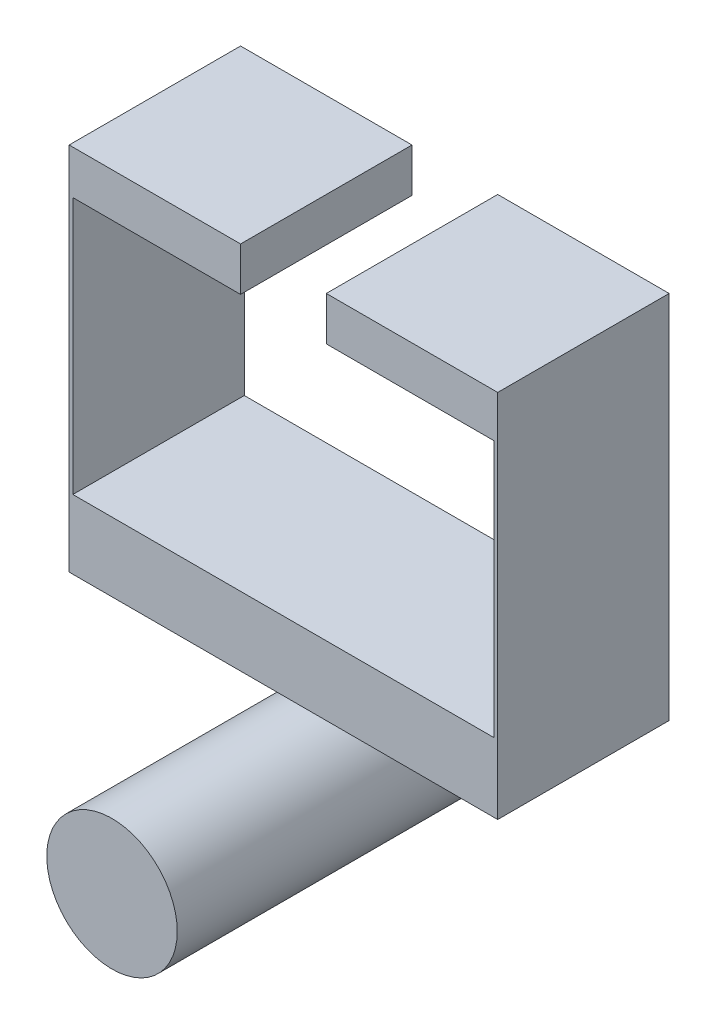
ISO-10303-21;
HEADER;
FILE_DESCRIPTION(('STEP AP214'),'2;1');
FILE_NAME('part.step','',(''),(''),'','','');
FILE_SCHEMA(('AUTOMOTIVE_DESIGN { 1 0 10303 214 1 1 1 1 }'));
ENDSEC;
DATA;
#1=APPLICATION_CONTEXT('core data for automotive mechanical design processes');
#2=APPLICATION_PROTOCOL_DEFINITION('international standard','automotive_design',2000,#1);
#3=PRODUCT_CONTEXT('',#1,'mechanical');
#4=PRODUCT('Part','Part','',(#3));
#5=PRODUCT_RELATED_PRODUCT_CATEGORY('part','',(#4));
#6=PRODUCT_DEFINITION_FORMATION('','',#4);
#7=PRODUCT_DEFINITION_CONTEXT('part definition',#1,'design');
#8=PRODUCT_DEFINITION('design','',#6,#7);
#9=PRODUCT_DEFINITION_SHAPE('','',#8);
#10=(LENGTH_UNIT() NAMED_UNIT(*) SI_UNIT(.MILLI.,.METRE.));
#11=(NAMED_UNIT(*) PLANE_ANGLE_UNIT() SI_UNIT($,.RADIAN.));
#12=(NAMED_UNIT(*) SI_UNIT($,.STERADIAN.) SOLID_ANGLE_UNIT());
#13=UNCERTAINTY_MEASURE_WITH_UNIT(LENGTH_MEASURE(1.E-05),#10,'distance_accuracy_value','');
#14=(GEOMETRIC_REPRESENTATION_CONTEXT(3) GLOBAL_UNCERTAINTY_ASSIGNED_CONTEXT((#13)) GLOBAL_UNIT_ASSIGNED_CONTEXT((#10,
#11,#12)) REPRESENTATION_CONTEXT('',''));
#15=CARTESIAN_POINT('',(0.,0.,0.));
#16=DIRECTION('',(0.,0.,1.));
#17=DIRECTION('',(1.,0.,0.));
#18=AXIS2_PLACEMENT_3D('',#15,#16,#17);
#19=CARTESIAN_POINT('',(0.,0.,50.8));
#20=DIRECTION('',(0.,0.,-1.));
#21=DIRECTION('',(-1.,0.,0.));
#22=AXIS2_PLACEMENT_3D('',#19,#20,#21);
#23=CYLINDRICAL_SURFACE('',#22,9.66721513747675);
#24=CARTESIAN_POINT('',(0.,0.,50.8));
#25=DIRECTION('',(0.,0.,1.));
#26=DIRECTION('',(1.,0.,0.));
#27=AXIS2_PLACEMENT_3D('',#24,#25,#26);
#28=CIRCLE('',#27,9.66721513747675);
#29=CARTESIAN_POINT('',(9.66721513747675,0.,50.8));
#30=VERTEX_POINT('',#29);
#31=EDGE_CURVE('E55',#30,#30,#28,.T.);
#32=ORIENTED_EDGE('',*,*,#31,.F.);
#33=EDGE_LOOP('',(#32));
#34=FACE_BOUND('',#33,.T.);
#35=DIRECTION('',(0.,0.,-1.));
#36=VECTOR('',#35,1.);
#37=CARTESIAN_POINT('',(9.66721513747675,0.,8.89));
#38=LINE('',#37,#36);
#39=CARTESIAN_POINT('',(9.66721513747675,0.,8.89));
#40=VERTEX_POINT('',#39);
#41=CARTESIAN_POINT('',(9.66721513747675,0.,0.));
#42=VERTEX_POINT('',#41);
#43=EDGE_CURVE('E313',#40,#42,#38,.T.);
#44=ORIENTED_EDGE('',*,*,#43,.F.);
#45=CARTESIAN_POINT('',(0.,0.,8.89));
#46=DIRECTION('',(0.,0.,-1.));
#47=DIRECTION('',(-1.,0.,0.));
#48=AXIS2_PLACEMENT_3D('',#45,#46,#47);
#49=CIRCLE('',#48,9.66721513747675);
#50=CARTESIAN_POINT('',(-9.66721513747675,0.,8.89));
#51=VERTEX_POINT('',#50);
#52=EDGE_CURVE('E11',#51,#40,#49,.T.);
#53=ORIENTED_EDGE('',*,*,#52,.F.);
#54=DIRECTION('',(0.,0.,-1.));
#55=VECTOR('',#54,1.);
#56=CARTESIAN_POINT('',(-9.66721513747675,0.,8.89));
#57=LINE('',#56,#55);
#58=CARTESIAN_POINT('',(-9.66721513747675,0.,0.));
#59=VERTEX_POINT('',#58);
#60=EDGE_CURVE('E306',#51,#59,#57,.T.);
#61=ORIENTED_EDGE('',*,*,#60,.T.);
#62=CARTESIAN_POINT('',(0.,0.,0.));
#63=DIRECTION('',(0.,0.,1.));
#64=DIRECTION('',(1.,0.,0.));
#65=AXIS2_PLACEMENT_3D('',#62,#63,#64);
#66=CIRCLE('',#65,9.66721513747675);
#67=EDGE_CURVE('E317',#59,#42,#66,.T.);
#68=ORIENTED_EDGE('',*,*,#67,.T.);
#69=EDGE_LOOP('',(#44,#53,#61,#68));
#70=FACE_BOUND('',#69,.T.);
#71=ADVANCED_FACE('F47',(#34,#70),#23,.T.);
#72=CARTESIAN_POINT('',(0.,0.,50.8));
#73=DIRECTION('',(0.,0.,1.));
#74=DIRECTION('',(1.,0.,0.));
#75=AXIS2_PLACEMENT_3D('',#72,#73,#74);
#76=PLANE('',#75);
#77=ORIENTED_EDGE('',*,*,#31,.T.);
#78=EDGE_LOOP('',(#77));
#79=FACE_BOUND('',#78,.T.);
#80=ADVANCED_FACE('F398',(#79),#76,.T.);
#81=CARTESIAN_POINT('',(0.,0.,0.));
#82=DIRECTION('',(0.,0.,1.));
#83=DIRECTION('',(1.,0.,0.));
#84=AXIS2_PLACEMENT_3D('',#81,#82,#83);
#85=PLANE('',#84);
#86=ORIENTED_EDGE('',*,*,#67,.F.);
#87=DIRECTION('',(0.,1.,0.));
#88=VECTOR('',#87,1.);
#89=CARTESIAN_POINT('',(-9.66721513747675,0.,0.));
#90=LINE('',#89,#88);
#91=CARTESIAN_POINT('',(-9.66721513747675,12.7,0.));
#92=VERTEX_POINT('',#91);
#93=EDGE_CURVE('E290',#59,#92,#90,.T.);
#94=ORIENTED_EDGE('',*,*,#93,.T.);
#95=DIRECTION('',(-1.,0.,0.));
#96=VECTOR('',#95,1.);
#97=CARTESIAN_POINT('',(-9.66721513747675,12.7,0.));
#98=LINE('',#97,#96);
#99=CARTESIAN_POINT('',(-31.75,12.7,0.));
#100=VERTEX_POINT('',#99);
#101=EDGE_CURVE('E170',#92,#100,#98,.T.);
#102=ORIENTED_EDGE('',*,*,#101,.T.);
#103=DIRECTION('',(0.,1.,0.));
#104=VECTOR('',#103,1.);
#105=CARTESIAN_POINT('',(-31.75,22.935187233977,0.));
#106=LINE('',#105,#104);
#107=CARTESIAN_POINT('',(-31.75,67.5084880215063,0.));
#108=VERTEX_POINT('',#107);
#109=EDGE_CURVE('E264',#100,#108,#106,.T.);
#110=ORIENTED_EDGE('',*,*,#109,.T.);
#111=DIRECTION('',(1.,0.,0.));
#112=VECTOR('',#111,1.);
#113=CARTESIAN_POINT('',(-31.75,67.5084880215063,0.));
#114=LINE('',#113,#112);
#115=CARTESIAN_POINT('',(-6.35,67.5084880215063,0.));
#116=VERTEX_POINT('',#115);
#117=EDGE_CURVE('E199',#108,#116,#114,.T.);
#118=ORIENTED_EDGE('',*,*,#117,.T.);
#119=DIRECTION('',(0.,-1.,0.));
#120=VECTOR('',#119,1.);
#121=CARTESIAN_POINT('',(-6.35,61.035187233977,0.));
#122=LINE('',#121,#120);
#123=CARTESIAN_POINT('',(-6.35,61.035187233977,0.));
#124=VERTEX_POINT('',#123);
#125=EDGE_CURVE('E222',#116,#124,#122,.T.);
#126=ORIENTED_EDGE('',*,*,#125,.T.);
#127=DIRECTION('',(-1.,0.,0.));
#128=VECTOR('',#127,1.);
#129=CARTESIAN_POINT('',(-31.75,61.035187233977,0.));
#130=LINE('',#129,#128);
#131=CARTESIAN_POINT('',(-31.2000836865377,61.035187233977,0.));
#132=VERTEX_POINT('',#131);
#133=EDGE_CURVE('E211',#124,#132,#130,.T.);
#134=ORIENTED_EDGE('',*,*,#133,.T.);
#135=DIRECTION('',(0.,-1.,0.));
#136=VECTOR('',#135,1.);
#137=CARTESIAN_POINT('',(-31.2000836865377,22.935187233977,0.));
#138=LINE('',#137,#136);
#139=CARTESIAN_POINT('',(-31.2000836865377,22.935187233977,0.));
#140=VERTEX_POINT('',#139);
#141=EDGE_CURVE('E248',#132,#140,#138,.T.);
#142=ORIENTED_EDGE('',*,*,#141,.T.);
#143=DIRECTION('',(1.,0.,0.));
#144=VECTOR('',#143,1.);
#145=CARTESIAN_POINT('',(31.75,22.935187233977,0.));
#146=LINE('',#145,#144);
#147=CARTESIAN_POINT('',(31.2000836865377,22.935187233977,0.));
#148=VERTEX_POINT('',#147);
#149=EDGE_CURVE('E171',#140,#148,#146,.T.);
#150=ORIENTED_EDGE('',*,*,#149,.T.);
#151=DIRECTION('',(0.,1.,0.));
#152=VECTOR('',#151,1.);
#153=CARTESIAN_POINT('',(31.2000836865377,22.935187233977,0.));
#154=LINE('',#153,#152);
#155=CARTESIAN_POINT('',(31.2000836865377,61.035187233977,0.));
#156=VERTEX_POINT('',#155);
#157=EDGE_CURVE('E244',#148,#156,#154,.T.);
#158=ORIENTED_EDGE('',*,*,#157,.T.);
#159=DIRECTION('',(-1.,0.,0.));
#160=VECTOR('',#159,1.);
#161=CARTESIAN_POINT('',(31.75,61.035187233977,0.));
#162=LINE('',#161,#160);
#163=CARTESIAN_POINT('',(6.35,61.035187233977,0.));
#164=VERTEX_POINT('',#163);
#165=EDGE_CURVE('E191',#156,#164,#162,.T.);
#166=ORIENTED_EDGE('',*,*,#165,.T.);
#167=DIRECTION('',(0.,1.,0.));
#168=VECTOR('',#167,1.);
#169=CARTESIAN_POINT('',(6.35,61.035187233977,0.));
#170=LINE('',#169,#168);
#171=CARTESIAN_POINT('',(6.35,67.5084880215063,0.));
#172=VERTEX_POINT('',#171);
#173=EDGE_CURVE('E185',#164,#172,#170,.T.);
#174=ORIENTED_EDGE('',*,*,#173,.T.);
#175=DIRECTION('',(1.,0.,0.));
#176=VECTOR('',#175,1.);
#177=CARTESIAN_POINT('',(31.75,67.5084880215063,0.));
#178=LINE('',#177,#176);
#179=CARTESIAN_POINT('',(31.75,67.5084880215063,0.));
#180=VERTEX_POINT('',#179);
#181=EDGE_CURVE('E176',#172,#180,#178,.T.);
#182=ORIENTED_EDGE('',*,*,#181,.T.);
#183=DIRECTION('',(0.,-1.,0.));
#184=VECTOR('',#183,1.);
#185=CARTESIAN_POINT('',(31.75,12.7,0.));
#186=LINE('',#185,#184);
#187=CARTESIAN_POINT('',(31.75,12.7,0.));
#188=VERTEX_POINT('',#187);
#189=EDGE_CURVE('E159',#180,#188,#186,.T.);
#190=ORIENTED_EDGE('',*,*,#189,.T.);
#191=CARTESIAN_POINT('',(9.66721513747675,12.7,0.));
#192=VERTEX_POINT('',#191);
#193=EDGE_CURVE('E271',#188,#192,#98,.T.);
#194=ORIENTED_EDGE('',*,*,#193,.T.);
#195=DIRECTION('',(0.,-1.,0.));
#196=VECTOR('',#195,1.);
#197=CARTESIAN_POINT('',(9.66721513747675,12.7,0.));
#198=LINE('',#197,#196);
#199=EDGE_CURVE('E298',#192,#42,#198,.T.);
#200=ORIENTED_EDGE('',*,*,#199,.T.);
#201=EDGE_LOOP('',(#86,#94,#102,#110,#118,#126,#134,#142,#150,#158,#166,#174,#182,#190,#194,#200));
#202=FACE_BOUND('',#201,.T.);
#203=ADVANCED_FACE('F183',(#202),#85,.F.);
#204=CARTESIAN_POINT('',(9.66721513747675,12.7,8.89));
#205=DIRECTION('',(1.,0.,0.));
#206=DIRECTION('',(0.,1.,0.));
#207=AXIS2_PLACEMENT_3D('',#204,#205,#206);
#208=PLANE('',#207);
#209=ORIENTED_EDGE('',*,*,#199,.F.);
#210=DIRECTION('',(0.,0.,-1.));
#211=VECTOR('',#210,1.);
#212=CARTESIAN_POINT('',(9.66721513747675,12.7,8.89));
#213=LINE('',#212,#211);
#214=CARTESIAN_POINT('',(9.66721513747675,12.7,8.89));
#215=VERTEX_POINT('',#214);
#216=EDGE_CURVE('E318',#215,#192,#213,.T.);
#217=ORIENTED_EDGE('',*,*,#216,.F.);
#218=DIRECTION('',(0.,-1.,0.));
#219=VECTOR('',#218,1.);
#220=CARTESIAN_POINT('',(9.66721513747675,12.7,8.89));
#221=LINE('',#220,#219);
#222=EDGE_CURVE('E302',#215,#40,#221,.T.);
#223=ORIENTED_EDGE('',*,*,#222,.T.);
#224=ORIENTED_EDGE('',*,*,#43,.T.);
#225=EDGE_LOOP('',(#209,#217,#223,#224));
#226=FACE_BOUND('',#225,.T.);
#227=ADVANCED_FACE('F335',(#226),#208,.T.);
#228=CARTESIAN_POINT('',(-9.66721513747675,0.,8.89));
#229=DIRECTION('',(-1.,0.,0.));
#230=DIRECTION('',(0.,0.,1.));
#231=AXIS2_PLACEMENT_3D('',#228,#229,#230);
#232=PLANE('',#231);
#233=ORIENTED_EDGE('',*,*,#93,.F.);
#234=ORIENTED_EDGE('',*,*,#60,.F.);
#235=DIRECTION('',(0.,1.,0.));
#236=VECTOR('',#235,1.);
#237=CARTESIAN_POINT('',(-9.66721513747675,0.,8.89));
#238=LINE('',#237,#236);
#239=CARTESIAN_POINT('',(-9.66721513747675,12.7,8.89));
#240=VERTEX_POINT('',#239);
#241=EDGE_CURVE('E293',#51,#240,#238,.T.);
#242=ORIENTED_EDGE('',*,*,#241,.T.);
#243=DIRECTION('',(0.,0.,-1.));
#244=VECTOR('',#243,1.);
#245=CARTESIAN_POINT('',(-9.66721513747675,12.7,8.89));
#246=LINE('',#245,#244);
#247=EDGE_CURVE('E322',#240,#92,#246,.T.);
#248=ORIENTED_EDGE('',*,*,#247,.T.);
#249=EDGE_LOOP('',(#233,#234,#242,#248));
#250=FACE_BOUND('',#249,.T.);
#251=ADVANCED_FACE('F345',(#250),#232,.T.);
#252=CARTESIAN_POINT('',(0.,0.,8.89));
#253=DIRECTION('',(0.,0.,-1.));
#254=DIRECTION('',(-1.,0.,0.));
#255=AXIS2_PLACEMENT_3D('',#252,#253,#254);
#256=PLANE('',#255);
#257=ORIENTED_EDGE('',*,*,#241,.F.);
#258=ORIENTED_EDGE('',*,*,#52,.T.);
#259=ORIENTED_EDGE('',*,*,#222,.F.);
#260=DIRECTION('',(1.,0.,0.));
#261=VECTOR('',#260,1.);
#262=CARTESIAN_POINT('',(-9.66721513747675,12.7,8.89));
#263=LINE('',#262,#261);
#264=EDGE_CURVE('E297',#240,#215,#263,.T.);
#265=ORIENTED_EDGE('',*,*,#264,.F.);
#266=EDGE_LOOP('',(#257,#258,#259,#265));
#267=FACE_BOUND('',#266,.T.);
#268=ADVANCED_FACE('F343',(#267),#256,.F.);
#269=CARTESIAN_POINT('',(-9.66721513747675,12.7,25.4));
#270=DIRECTION('',(0.,-1.,0.));
#271=DIRECTION('',(1.,0.,0.));
#272=AXIS2_PLACEMENT_3D('',#269,#270,#271);
#273=PLANE('',#272);
#274=ORIENTED_EDGE('',*,*,#247,.F.);
#275=ORIENTED_EDGE('',*,*,#264,.T.);
#276=ORIENTED_EDGE('',*,*,#216,.T.);
#277=ORIENTED_EDGE('',*,*,#193,.F.);
#278=DIRECTION('',(0.,0.,-1.));
#279=VECTOR('',#278,1.);
#280=CARTESIAN_POINT('',(31.75,12.7,25.4));
#281=LINE('',#280,#279);
#282=CARTESIAN_POINT('',(31.75,12.7,25.4));
#283=VERTEX_POINT('',#282);
#284=EDGE_CURVE('E165',#283,#188,#281,.T.);
#285=ORIENTED_EDGE('',*,*,#284,.F.);
#286=DIRECTION('',(-1.,0.,0.));
#287=VECTOR('',#286,1.);
#288=CARTESIAN_POINT('',(31.75,12.7,25.4));
#289=LINE('',#288,#287);
#290=CARTESIAN_POINT('',(-31.75,12.7,25.4));
#291=VERTEX_POINT('',#290);
#292=EDGE_CURVE('E277',#283,#291,#289,.T.);
#293=ORIENTED_EDGE('',*,*,#292,.T.);
#294=DIRECTION('',(0.,0.,-1.));
#295=VECTOR('',#294,1.);
#296=CARTESIAN_POINT('',(-31.75,12.7,25.4));
#297=LINE('',#296,#295);
#298=EDGE_CURVE('E286',#291,#100,#297,.T.);
#299=ORIENTED_EDGE('',*,*,#298,.T.);
#300=ORIENTED_EDGE('',*,*,#101,.F.);
#301=EDGE_LOOP('',(#274,#275,#276,#277,#285,#293,#299,#300));
#302=FACE_BOUND('',#301,.T.);
#303=ADVANCED_FACE('F339',(#302),#273,.T.);
#304=CARTESIAN_POINT('',(-31.75,22.935187233977,25.4));
#305=DIRECTION('',(-1.,0.,0.));
#306=DIRECTION('',(0.,0.,1.));
#307=AXIS2_PLACEMENT_3D('',#304,#305,#306);
#308=PLANE('',#307);
#309=ORIENTED_EDGE('',*,*,#109,.F.);
#310=ORIENTED_EDGE('',*,*,#298,.F.);
#311=DIRECTION('',(0.,1.,0.));
#312=VECTOR('',#311,1.);
#313=CARTESIAN_POINT('',(-31.75,22.935187233977,25.4));
#314=LINE('',#313,#312);
#315=CARTESIAN_POINT('',(-31.75,67.5084880215063,25.4));
#316=VERTEX_POINT('',#315);
#317=EDGE_CURVE('E268',#291,#316,#314,.T.);
#318=ORIENTED_EDGE('',*,*,#317,.T.);
#319=DIRECTION('',(0.,0.,-1.));
#320=VECTOR('',#319,1.);
#321=CARTESIAN_POINT('',(-31.75,67.5084880215063,25.4));
#322=LINE('',#321,#320);
#323=EDGE_CURVE('E218',#316,#108,#322,.T.);
#324=ORIENTED_EDGE('',*,*,#323,.T.);
#325=EDGE_LOOP('',(#309,#310,#318,#324));
#326=FACE_BOUND('',#325,.T.);
#327=ADVANCED_FACE('F352',(#326),#308,.T.);
#328=CARTESIAN_POINT('',(31.75,12.7,25.4));
#329=DIRECTION('',(1.,0.,0.));
#330=DIRECTION('',(0.,0.,-1.));
#331=AXIS2_PLACEMENT_3D('',#328,#329,#330);
#332=PLANE('',#331);
#333=ORIENTED_EDGE('',*,*,#189,.F.);
#334=DIRECTION('',(0.,0.,-1.));
#335=VECTOR('',#334,1.);
#336=CARTESIAN_POINT('',(31.75,67.5084880215063,25.4));
#337=LINE('',#336,#335);
#338=CARTESIAN_POINT('',(31.75,67.5084880215063,25.4));
#339=VERTEX_POINT('',#338);
#340=EDGE_CURVE('E163',#339,#180,#337,.T.);
#341=ORIENTED_EDGE('',*,*,#340,.F.);
#342=DIRECTION('',(0.,-1.,0.));
#343=VECTOR('',#342,1.);
#344=CARTESIAN_POINT('',(31.75,12.7,25.4));
#345=LINE('',#344,#343);
#346=EDGE_CURVE('E274',#339,#283,#345,.T.);
#347=ORIENTED_EDGE('',*,*,#346,.T.);
#348=ORIENTED_EDGE('',*,*,#284,.T.);
#349=EDGE_LOOP('',(#333,#341,#347,#348));
#350=FACE_BOUND('',#349,.T.);
#351=ADVANCED_FACE('F161',(#350),#332,.T.);
#352=CARTESIAN_POINT('',(31.75,22.935187233977,25.4));
#353=DIRECTION('',(0.,1.,0.));
#354=DIRECTION('',(0.,0.,1.));
#355=AXIS2_PLACEMENT_3D('',#352,#353,#354);
#356=PLANE('',#355);
#357=DIRECTION('',(0.,0.,-1.));
#358=VECTOR('',#357,1.);
#359=CARTESIAN_POINT('',(31.2000836865377,22.935187233977,25.4));
#360=LINE('',#359,#358);
#361=CARTESIAN_POINT('',(31.2000836865377,22.935187233977,25.4));
#362=VERTEX_POINT('',#361);
#363=EDGE_CURVE('E62',#362,#148,#360,.T.);
#364=ORIENTED_EDGE('',*,*,#363,.T.);
#365=ORIENTED_EDGE('',*,*,#149,.F.);
#366=DIRECTION('',(0.,0.,-1.));
#367=VECTOR('',#366,1.);
#368=CARTESIAN_POINT('',(-31.2000836865377,22.935187233977,25.4));
#369=LINE('',#368,#367);
#370=CARTESIAN_POINT('',(-31.2000836865377,22.935187233977,25.4));
#371=VERTEX_POINT('',#370);
#372=EDGE_CURVE('E260',#371,#140,#369,.T.);
#373=ORIENTED_EDGE('',*,*,#372,.F.);
#374=DIRECTION('',(1.,0.,0.));
#375=VECTOR('',#374,1.);
#376=CARTESIAN_POINT('',(31.75,22.935187233977,25.4));
#377=LINE('',#376,#375);
#378=EDGE_CURVE('E67',#371,#362,#377,.T.);
#379=ORIENTED_EDGE('',*,*,#378,.T.);
#380=EDGE_LOOP('',(#364,#365,#373,#379));
#381=FACE_BOUND('',#380,.T.);
#382=ADVANCED_FACE('F372',(#381),#356,.T.);
#383=CARTESIAN_POINT('',(0.,0.,25.4));
#384=DIRECTION('',(0.,0.,-1.));
#385=DIRECTION('',(-1.,0.,0.));
#386=AXIS2_PLACEMENT_3D('',#383,#384,#385);
#387=PLANE('',#386);
#388=ORIENTED_EDGE('',*,*,#317,.F.);
#389=ORIENTED_EDGE('',*,*,#292,.F.);
#390=ORIENTED_EDGE('',*,*,#346,.F.);
#391=DIRECTION('',(1.,0.,0.));
#392=VECTOR('',#391,1.);
#393=CARTESIAN_POINT('',(31.75,67.5084880215063,25.4));
#394=LINE('',#393,#392);
#395=CARTESIAN_POINT('',(6.35,67.5084880215063,25.4));
#396=VERTEX_POINT('',#395);
#397=EDGE_CURVE('E178',#396,#339,#394,.T.);
#398=ORIENTED_EDGE('',*,*,#397,.F.);
#399=DIRECTION('',(0.,1.,0.));
#400=VECTOR('',#399,1.);
#401=CARTESIAN_POINT('',(6.35,61.035187233977,25.4));
#402=LINE('',#401,#400);
#403=CARTESIAN_POINT('',(6.35,61.035187233977,25.4));
#404=VERTEX_POINT('',#403);
#405=EDGE_CURVE('E193',#404,#396,#402,.T.);
#406=ORIENTED_EDGE('',*,*,#405,.F.);
#407=DIRECTION('',(-1.,0.,0.));
#408=VECTOR('',#407,1.);
#409=CARTESIAN_POINT('',(31.75,61.035187233977,25.4));
#410=LINE('',#409,#408);
#411=CARTESIAN_POINT('',(31.2000836865377,61.035187233977,25.4));
#412=VERTEX_POINT('',#411);
#413=EDGE_CURVE('E187',#412,#404,#410,.T.);
#414=ORIENTED_EDGE('',*,*,#413,.F.);
#415=DIRECTION('',(0.,1.,0.));
#416=VECTOR('',#415,1.);
#417=CARTESIAN_POINT('',(31.2000836865377,22.935187233977,25.4));
#418=LINE('',#417,#416);
#419=EDGE_CURVE('E240',#362,#412,#418,.T.);
#420=ORIENTED_EDGE('',*,*,#419,.F.);
#421=ORIENTED_EDGE('',*,*,#378,.F.);
#422=DIRECTION('',(0.,-1.,0.));
#423=VECTOR('',#422,1.);
#424=CARTESIAN_POINT('',(-31.2000836865377,22.935187233977,25.4));
#425=LINE('',#424,#423);
#426=CARTESIAN_POINT('',(-31.2000836865377,61.035187233977,25.4));
#427=VERTEX_POINT('',#426);
#428=EDGE_CURVE('E252',#427,#371,#425,.T.);
#429=ORIENTED_EDGE('',*,*,#428,.F.);
#430=DIRECTION('',(-1.,0.,0.));
#431=VECTOR('',#430,1.);
#432=CARTESIAN_POINT('',(-31.75,61.035187233977,25.4));
#433=LINE('',#432,#431);
#434=CARTESIAN_POINT('',(-6.35,61.035187233977,25.4));
#435=VERTEX_POINT('',#434);
#436=EDGE_CURVE('E215',#435,#427,#433,.T.);
#437=ORIENTED_EDGE('',*,*,#436,.F.);
#438=DIRECTION('',(0.,-1.,0.));
#439=VECTOR('',#438,1.);
#440=CARTESIAN_POINT('',(-6.35,61.035187233977,25.4));
#441=LINE('',#440,#439);
#442=CARTESIAN_POINT('',(-6.35,67.5084880215063,25.4));
#443=VERTEX_POINT('',#442);
#444=EDGE_CURVE('E210',#443,#435,#441,.T.);
#445=ORIENTED_EDGE('',*,*,#444,.F.);
#446=DIRECTION('',(1.,0.,0.));
#447=VECTOR('',#446,1.);
#448=CARTESIAN_POINT('',(-31.75,67.5084880215063,25.4));
#449=LINE('',#448,#447);
#450=EDGE_CURVE('E206',#316,#443,#449,.T.);
#451=ORIENTED_EDGE('',*,*,#450,.F.);
#452=EDGE_LOOP('',(#388,#389,#390,#398,#406,#414,#420,#421,#429,#437,#445,#451));
#453=FACE_BOUND('',#452,.T.);
#454=ADVANCED_FACE('F375',(#453),#387,.F.);
#455=CARTESIAN_POINT('',(-31.2000836865377,22.935187233977,25.4));
#456=DIRECTION('',(1.,0.,0.));
#457=DIRECTION('',(0.,0.,-1.));
#458=AXIS2_PLACEMENT_3D('',#455,#456,#457);
#459=PLANE('',#458);
#460=ORIENTED_EDGE('',*,*,#141,.F.);
#461=DIRECTION('',(0.,0.,-1.));
#462=VECTOR('',#461,1.);
#463=CARTESIAN_POINT('',(-31.2000836865377,61.035187233977,25.4));
#464=LINE('',#463,#462);
#465=EDGE_CURVE('E256',#427,#132,#464,.T.);
#466=ORIENTED_EDGE('',*,*,#465,.F.);
#467=ORIENTED_EDGE('',*,*,#428,.T.);
#468=ORIENTED_EDGE('',*,*,#372,.T.);
#469=EDGE_LOOP('',(#460,#466,#467,#468));
#470=FACE_BOUND('',#469,.T.);
#471=ADVANCED_FACE('F370',(#470),#459,.T.);
#472=CARTESIAN_POINT('',(31.2000836865377,22.935187233977,25.4));
#473=DIRECTION('',(-1.,0.,0.));
#474=DIRECTION('',(0.,0.,1.));
#475=AXIS2_PLACEMENT_3D('',#472,#473,#474);
#476=PLANE('',#475);
#477=ORIENTED_EDGE('',*,*,#157,.F.);
#478=ORIENTED_EDGE('',*,*,#363,.F.);
#479=ORIENTED_EDGE('',*,*,#419,.T.);
#480=DIRECTION('',(0.,0.,-1.));
#481=VECTOR('',#480,1.);
#482=CARTESIAN_POINT('',(31.2000836865377,61.035187233977,25.4));
#483=LINE('',#482,#481);
#484=EDGE_CURVE('E231',#412,#156,#483,.T.);
#485=ORIENTED_EDGE('',*,*,#484,.T.);
#486=EDGE_LOOP('',(#477,#478,#479,#485));
#487=FACE_BOUND('',#486,.T.);
#488=ADVANCED_FACE('F379',(#487),#476,.T.);
#489=CARTESIAN_POINT('',(-31.75,61.035187233977,25.4));
#490=DIRECTION('',(0.,-1.,0.));
#491=DIRECTION('',(0.,0.,-1.));
#492=AXIS2_PLACEMENT_3D('',#489,#490,#491);
#493=PLANE('',#492);
#494=ORIENTED_EDGE('',*,*,#436,.T.);
#495=ORIENTED_EDGE('',*,*,#465,.T.);
#496=ORIENTED_EDGE('',*,*,#133,.F.);
#497=DIRECTION('',(0.,0.,-1.));
#498=VECTOR('',#497,1.);
#499=CARTESIAN_POINT('',(-6.35,61.035187233977,25.4));
#500=LINE('',#499,#498);
#501=EDGE_CURVE('E228',#435,#124,#500,.T.);
#502=ORIENTED_EDGE('',*,*,#501,.F.);
#503=EDGE_LOOP('',(#494,#495,#496,#502));
#504=FACE_BOUND('',#503,.T.);
#505=ADVANCED_FACE('F365',(#504),#493,.T.);
#506=CARTESIAN_POINT('',(-6.35,61.035187233977,25.4));
#507=DIRECTION('',(1.,0.,0.));
#508=DIRECTION('',(0.,0.,-1.));
#509=AXIS2_PLACEMENT_3D('',#506,#507,#508);
#510=PLANE('',#509);
#511=ORIENTED_EDGE('',*,*,#125,.F.);
#512=DIRECTION('',(0.,0.,-1.));
#513=VECTOR('',#512,1.);
#514=CARTESIAN_POINT('',(-6.35,67.5084880215063,25.4));
#515=LINE('',#514,#513);
#516=EDGE_CURVE('E232',#443,#116,#515,.T.);
#517=ORIENTED_EDGE('',*,*,#516,.F.);
#518=ORIENTED_EDGE('',*,*,#444,.T.);
#519=ORIENTED_EDGE('',*,*,#501,.T.);
#520=EDGE_LOOP('',(#511,#517,#518,#519));
#521=FACE_BOUND('',#520,.T.);
#522=ADVANCED_FACE('F362',(#521),#510,.T.);
#523=CARTESIAN_POINT('',(-31.75,67.5084880215063,25.4));
#524=DIRECTION('',(0.,1.,0.));
#525=DIRECTION('',(0.,0.,1.));
#526=AXIS2_PLACEMENT_3D('',#523,#524,#525);
#527=PLANE('',#526);
#528=ORIENTED_EDGE('',*,*,#117,.F.);
#529=ORIENTED_EDGE('',*,*,#323,.F.);
#530=ORIENTED_EDGE('',*,*,#450,.T.);
#531=ORIENTED_EDGE('',*,*,#516,.T.);
#532=EDGE_LOOP('',(#528,#529,#530,#531));
#533=FACE_BOUND('',#532,.T.);
#534=ADVANCED_FACE('F358',(#533),#527,.T.);
#535=CARTESIAN_POINT('',(31.75,67.5084880215063,25.4));
#536=DIRECTION('',(0.,1.,0.));
#537=DIRECTION('',(0.,0.,1.));
#538=AXIS2_PLACEMENT_3D('',#535,#536,#537);
#539=PLANE('',#538);
#540=ORIENTED_EDGE('',*,*,#181,.F.);
#541=DIRECTION('',(0.,0.,-1.));
#542=VECTOR('',#541,1.);
#543=CARTESIAN_POINT('',(6.35,67.5084880215063,25.4));
#544=LINE('',#543,#542);
#545=EDGE_CURVE('E180',#396,#172,#544,.T.);
#546=ORIENTED_EDGE('',*,*,#545,.F.);
#547=ORIENTED_EDGE('',*,*,#397,.T.);
#548=ORIENTED_EDGE('',*,*,#340,.T.);
#549=EDGE_LOOP('',(#540,#546,#547,#548));
#550=FACE_BOUND('',#549,.T.);
#551=ADVANCED_FACE('F175',(#550),#539,.T.);
#552=CARTESIAN_POINT('',(6.35,61.035187233977,25.4));
#553=DIRECTION('',(-1.,0.,0.));
#554=DIRECTION('',(0.,0.,1.));
#555=AXIS2_PLACEMENT_3D('',#552,#553,#554);
#556=PLANE('',#555);
#557=ORIENTED_EDGE('',*,*,#173,.F.);
#558=DIRECTION('',(0.,0.,-1.));
#559=VECTOR('',#558,1.);
#560=CARTESIAN_POINT('',(6.35,61.035187233977,25.4));
#561=LINE('',#560,#559);
#562=EDGE_CURVE('E202',#404,#164,#561,.T.);
#563=ORIENTED_EDGE('',*,*,#562,.F.);
#564=ORIENTED_EDGE('',*,*,#405,.T.);
#565=ORIENTED_EDGE('',*,*,#545,.T.);
#566=EDGE_LOOP('',(#557,#563,#564,#565));
#567=FACE_BOUND('',#566,.T.);
#568=ADVANCED_FACE('F387',(#567),#556,.T.);
#569=CARTESIAN_POINT('',(31.75,61.035187233977,25.4));
#570=DIRECTION('',(0.,-1.,0.));
#571=DIRECTION('',(0.,0.,-1.));
#572=AXIS2_PLACEMENT_3D('',#569,#570,#571);
#573=PLANE('',#572);
#574=ORIENTED_EDGE('',*,*,#165,.F.);
#575=ORIENTED_EDGE('',*,*,#484,.F.);
#576=ORIENTED_EDGE('',*,*,#413,.T.);
#577=ORIENTED_EDGE('',*,*,#562,.T.);
#578=EDGE_LOOP('',(#574,#575,#576,#577));
#579=FACE_BOUND('',#578,.T.);
#580=ADVANCED_FACE('F383',(#579),#573,.T.);
#581=CLOSED_SHELL('',(#71,#80,#203,#227,#251,#268,#303,#327,#351,#382,#454,#471,#488,#505,#522,
#534,#551,#568,#580));
#582=MANIFOLD_SOLID_BREP('B2',#581);
#583=ADVANCED_BREP_SHAPE_REPRESENTATION('',(#18,#582),#14);
#584=SHAPE_DEFINITION_REPRESENTATION(#9,#583);
ENDSEC;
END-ISO-10303-21;
